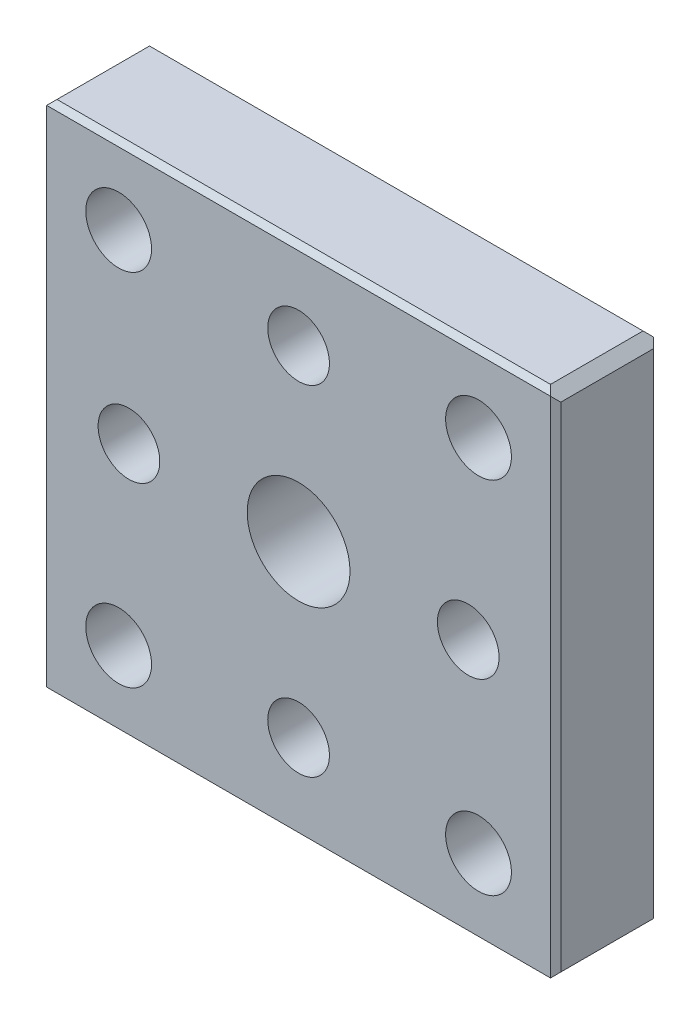
ISO-10303-21;
HEADER;
FILE_DESCRIPTION(('STEP AP214'),'2;1');
FILE_NAME('part.step','',(''),(''),'','','');
FILE_SCHEMA(('AUTOMOTIVE_DESIGN { 1 0 10303 214 1 1 1 1 }'));
ENDSEC;
DATA;
#1=APPLICATION_CONTEXT('core data for automotive mechanical design processes');
#2=APPLICATION_PROTOCOL_DEFINITION('international standard','automotive_design',2000,#1);
#3=PRODUCT_CONTEXT('',#1,'mechanical');
#4=PRODUCT('Part','Part','',(#3));
#5=PRODUCT_RELATED_PRODUCT_CATEGORY('part','',(#4));
#6=PRODUCT_DEFINITION_FORMATION('','',#4);
#7=PRODUCT_DEFINITION_CONTEXT('part definition',#1,'design');
#8=PRODUCT_DEFINITION('design','',#6,#7);
#9=PRODUCT_DEFINITION_SHAPE('','',#8);
#10=(LENGTH_UNIT() NAMED_UNIT(*) SI_UNIT(.MILLI.,.METRE.));
#11=(NAMED_UNIT(*) PLANE_ANGLE_UNIT() SI_UNIT($,.RADIAN.));
#12=(NAMED_UNIT(*) SI_UNIT($,.STERADIAN.) SOLID_ANGLE_UNIT());
#13=UNCERTAINTY_MEASURE_WITH_UNIT(LENGTH_MEASURE(1.E-05),#10,'distance_accuracy_value','');
#14=(GEOMETRIC_REPRESENTATION_CONTEXT(3) GLOBAL_UNCERTAINTY_ASSIGNED_CONTEXT((#13)) GLOBAL_UNIT_ASSIGNED_CONTEXT((#10,
#11,#12)) REPRESENTATION_CONTEXT('',''));
#15=CARTESIAN_POINT('',(0.,0.,0.));
#16=DIRECTION('',(0.,0.,1.));
#17=DIRECTION('',(1.,0.,0.));
#18=AXIS2_PLACEMENT_3D('',#15,#16,#17);
#19=CARTESIAN_POINT('',(0.,-16.5,-5.));
#20=DIRECTION('',(0.,0.,-1.));
#21=DIRECTION('',(-1.,0.,0.));
#22=AXIS2_PLACEMENT_3D('',#19,#20,#21);
#23=CYLINDRICAL_SURFACE('',#22,3.);
#24=CARTESIAN_POINT('',(0.,-16.5,5.));
#25=DIRECTION('',(0.,0.,-1.));
#26=DIRECTION('',(-1.,0.,0.));
#27=AXIS2_PLACEMENT_3D('',#24,#25,#26);
#28=CIRCLE('',#27,3.);
#29=CARTESIAN_POINT('',(-3.00000000000009,-16.5,5.));
#30=VERTEX_POINT('',#29);
#31=EDGE_CURVE('E312',#30,#30,#28,.T.);
#32=ORIENTED_EDGE('',*,*,#31,.F.);
#33=EDGE_LOOP('',(#32));
#34=FACE_BOUND('',#33,.T.);
#35=CARTESIAN_POINT('',(0.,-16.5,-2.));
#36=DIRECTION('',(0.,0.,-1.));
#37=DIRECTION('',(-1.,0.,0.));
#38=AXIS2_PLACEMENT_3D('',#35,#36,#37);
#39=CIRCLE('',#38,3.);
#40=CARTESIAN_POINT('',(-3.00000000000009,-16.5,-2.));
#41=VERTEX_POINT('',#40);
#42=EDGE_CURVE('E64',#41,#41,#39,.F.);
#43=ORIENTED_EDGE('',*,*,#42,.F.);
#44=EDGE_LOOP('',(#43));
#45=FACE_BOUND('',#44,.T.);
#46=ADVANCED_FACE('F59',(#34,#45),#23,.F.);
#47=CARTESIAN_POINT('',(-16.5000000000001,0.,-5.));
#48=DIRECTION('',(0.,0.,-1.));
#49=DIRECTION('',(-1.,0.,0.));
#50=AXIS2_PLACEMENT_3D('',#47,#48,#49);
#51=CYLINDRICAL_SURFACE('',#50,3.);
#52=CARTESIAN_POINT('',(-16.5000000000001,0.,5.));
#53=DIRECTION('',(0.,0.,-1.));
#54=DIRECTION('',(-1.,0.,0.));
#55=AXIS2_PLACEMENT_3D('',#52,#53,#54);
#56=CIRCLE('',#55,3.);
#57=CARTESIAN_POINT('',(-19.5000000000001,0.,5.));
#58=VERTEX_POINT('',#57);
#59=EDGE_CURVE('E303',#58,#58,#56,.T.);
#60=ORIENTED_EDGE('',*,*,#59,.F.);
#61=EDGE_LOOP('',(#60));
#62=FACE_BOUND('',#61,.T.);
#63=CARTESIAN_POINT('',(-16.5000000000001,0.,-2.));
#64=DIRECTION('',(0.,0.,-1.));
#65=DIRECTION('',(-1.,0.,0.));
#66=AXIS2_PLACEMENT_3D('',#63,#64,#65);
#67=CIRCLE('',#66,3.);
#68=CARTESIAN_POINT('',(-19.5000000000001,0.,-2.));
#69=VERTEX_POINT('',#68);
#70=EDGE_CURVE('E282',#69,#69,#67,.F.);
#71=ORIENTED_EDGE('',*,*,#70,.F.);
#72=EDGE_LOOP('',(#71));
#73=FACE_BOUND('',#72,.T.);
#74=ADVANCED_FACE('F422',(#62,#73),#51,.F.);
#75=CARTESIAN_POINT('',(0.,16.5,-5.));
#76=DIRECTION('',(0.,0.,-1.));
#77=DIRECTION('',(-1.,0.,0.));
#78=AXIS2_PLACEMENT_3D('',#75,#76,#77);
#79=CYLINDRICAL_SURFACE('',#78,3.);
#80=CARTESIAN_POINT('',(0.,16.5,5.));
#81=DIRECTION('',(0.,0.,-1.));
#82=DIRECTION('',(-1.,0.,0.));
#83=AXIS2_PLACEMENT_3D('',#80,#81,#82);
#84=CIRCLE('',#83,3.);
#85=CARTESIAN_POINT('',(-3.00000000000009,16.5,5.));
#86=VERTEX_POINT('',#85);
#87=EDGE_CURVE('E296',#86,#86,#84,.T.);
#88=ORIENTED_EDGE('',*,*,#87,.F.);
#89=EDGE_LOOP('',(#88));
#90=FACE_BOUND('',#89,.T.);
#91=CARTESIAN_POINT('',(0.,16.5,-2.));
#92=DIRECTION('',(0.,0.,-1.));
#93=DIRECTION('',(-1.,0.,0.));
#94=AXIS2_PLACEMENT_3D('',#91,#92,#93);
#95=CIRCLE('',#94,3.);
#96=CARTESIAN_POINT('',(-3.00000000000009,16.5,-2.));
#97=VERTEX_POINT('',#96);
#98=EDGE_CURVE('E278',#97,#97,#95,.F.);
#99=ORIENTED_EDGE('',*,*,#98,.F.);
#100=EDGE_LOOP('',(#99));
#101=FACE_BOUND('',#100,.T.);
#102=ADVANCED_FACE('F429',(#90,#101),#79,.F.);
#103=CARTESIAN_POINT('',(16.4999999999999,0.,-5.));
#104=DIRECTION('',(0.,0.,-1.));
#105=DIRECTION('',(-1.,0.,0.));
#106=AXIS2_PLACEMENT_3D('',#103,#104,#105);
#107=CYLINDRICAL_SURFACE('',#106,3.);
#108=CARTESIAN_POINT('',(16.4999999999999,0.,5.));
#109=DIRECTION('',(0.,0.,-1.));
#110=DIRECTION('',(-1.,0.,0.));
#111=AXIS2_PLACEMENT_3D('',#108,#109,#110);
#112=CIRCLE('',#111,3.);
#113=CARTESIAN_POINT('',(13.4999999999999,0.,5.));
#114=VERTEX_POINT('',#113);
#115=EDGE_CURVE('E290',#114,#114,#112,.T.);
#116=ORIENTED_EDGE('',*,*,#115,.F.);
#117=EDGE_LOOP('',(#116));
#118=FACE_BOUND('',#117,.T.);
#119=CARTESIAN_POINT('',(16.4999999999999,0.,-2.));
#120=DIRECTION('',(0.,0.,-1.));
#121=DIRECTION('',(-1.,0.,0.));
#122=AXIS2_PLACEMENT_3D('',#119,#120,#121);
#123=CIRCLE('',#122,3.);
#124=CARTESIAN_POINT('',(13.4999999999999,0.,-2.));
#125=VERTEX_POINT('',#124);
#126=EDGE_CURVE('E274',#125,#125,#123,.F.);
#127=ORIENTED_EDGE('',*,*,#126,.F.);
#128=EDGE_LOOP('',(#127));
#129=FACE_BOUND('',#128,.T.);
#130=ADVANCED_FACE('F474',(#118,#129),#107,.F.);
#131=CARTESIAN_POINT('',(25.,-25.,5.));
#132=DIRECTION('',(-1.,0.,0.));
#133=DIRECTION('',(0.,0.,1.));
#134=AXIS2_PLACEMENT_3D('',#131,#132,#133);
#135=PLANE('',#134);
#136=DIRECTION('',(0.,0.,-1.));
#137=VECTOR('',#136,1.);
#138=CARTESIAN_POINT('',(25.,-24.,5.));
#139=LINE('',#138,#137);
#140=CARTESIAN_POINT('',(25.,-24.,4.49999999999999));
#141=VERTEX_POINT('',#140);
#142=CARTESIAN_POINT('',(25.,-24.,-4.5));
#143=VERTEX_POINT('',#142);
#144=EDGE_CURVE('E172',#141,#143,#139,.T.);
#145=ORIENTED_EDGE('',*,*,#144,.T.);
#146=DIRECTION('',(0.,1.,0.));
#147=VECTOR('',#146,1.);
#148=CARTESIAN_POINT('',(25.,24.,-4.5));
#149=LINE('',#148,#147);
#150=CARTESIAN_POINT('',(25.,24.,-4.5));
#151=VERTEX_POINT('',#150);
#152=EDGE_CURVE('E269',#143,#151,#149,.T.);
#153=ORIENTED_EDGE('',*,*,#152,.T.);
#154=DIRECTION('',(0.,0.,1.));
#155=VECTOR('',#154,1.);
#156=CARTESIAN_POINT('',(25.,24.,5.));
#157=LINE('',#156,#155);
#158=CARTESIAN_POINT('',(25.,24.,4.49999999999999));
#159=VERTEX_POINT('',#158);
#160=EDGE_CURVE('E356',#151,#159,#157,.T.);
#161=ORIENTED_EDGE('',*,*,#160,.T.);
#162=DIRECTION('',(0.,-1.,0.));
#163=VECTOR('',#162,1.);
#164=CARTESIAN_POINT('',(25.,-25.,4.49999999999999));
#165=LINE('',#164,#163);
#166=EDGE_CURVE('E266',#159,#141,#165,.T.);
#167=ORIENTED_EDGE('',*,*,#166,.T.);
#168=EDGE_LOOP('',(#145,#153,#161,#167));
#169=FACE_BOUND('',#168,.T.);
#170=ADVANCED_FACE('F406',(#169),#135,.F.);
#171=CARTESIAN_POINT('',(-25.,25.,5.));
#172=DIRECTION('',(0.,-1.,0.));
#173=DIRECTION('',(0.,0.,-1.));
#174=AXIS2_PLACEMENT_3D('',#171,#172,#173);
#175=PLANE('',#174);
#176=DIRECTION('',(0.,0.,-1.));
#177=VECTOR('',#176,1.);
#178=CARTESIAN_POINT('',(24.,25.,5.));
#179=LINE('',#178,#177);
#180=CARTESIAN_POINT('',(24.,25.,4.5));
#181=VERTEX_POINT('',#180);
#182=CARTESIAN_POINT('',(24.,25.,-4.5));
#183=VERTEX_POINT('',#182);
#184=EDGE_CURVE('E376',#181,#183,#179,.T.);
#185=ORIENTED_EDGE('',*,*,#184,.T.);
#186=DIRECTION('',(-1.,0.,0.));
#187=VECTOR('',#186,1.);
#188=CARTESIAN_POINT('',(-24.,25.,-4.5));
#189=LINE('',#188,#187);
#190=CARTESIAN_POINT('',(-24.,25.,-4.5));
#191=VERTEX_POINT('',#190);
#192=EDGE_CURVE('E239',#183,#191,#189,.T.);
#193=ORIENTED_EDGE('',*,*,#192,.T.);
#194=DIRECTION('',(0.,0.,1.));
#195=VECTOR('',#194,1.);
#196=CARTESIAN_POINT('',(-24.,25.,5.));
#197=LINE('',#196,#195);
#198=CARTESIAN_POINT('',(-24.,25.,4.5));
#199=VERTEX_POINT('',#198);
#200=EDGE_CURVE('E380',#191,#199,#197,.T.);
#201=ORIENTED_EDGE('',*,*,#200,.T.);
#202=DIRECTION('',(1.,0.,0.));
#203=VECTOR('',#202,1.);
#204=CARTESIAN_POINT('',(-25.,25.,4.5));
#205=LINE('',#204,#203);
#206=EDGE_CURVE('E236',#199,#181,#205,.T.);
#207=ORIENTED_EDGE('',*,*,#206,.T.);
#208=EDGE_LOOP('',(#185,#193,#201,#207));
#209=FACE_BOUND('',#208,.T.);
#210=ADVANCED_FACE('F467',(#209),#175,.F.);
#211=CARTESIAN_POINT('',(-25.,-25.,5.));
#212=DIRECTION('',(1.,0.,0.));
#213=DIRECTION('',(0.,0.,-1.));
#214=AXIS2_PLACEMENT_3D('',#211,#212,#213);
#215=PLANE('',#214);
#216=DIRECTION('',(0.,0.,-1.));
#217=VECTOR('',#216,1.);
#218=CARTESIAN_POINT('',(-25.,24.,5.));
#219=LINE('',#218,#217);
#220=CARTESIAN_POINT('',(-25.,24.,4.49999999999999));
#221=VERTEX_POINT('',#220);
#222=CARTESIAN_POINT('',(-25.,24.,-4.5));
#223=VERTEX_POINT('',#222);
#224=EDGE_CURVE('E368',#221,#223,#219,.T.);
#225=ORIENTED_EDGE('',*,*,#224,.T.);
#226=DIRECTION('',(0.,-1.,0.));
#227=VECTOR('',#226,1.);
#228=CARTESIAN_POINT('',(-25.,-24.,-4.5));
#229=LINE('',#228,#227);
#230=CARTESIAN_POINT('',(-25.,-24.,-4.5));
#231=VERTEX_POINT('',#230);
#232=EDGE_CURVE('E13',#223,#231,#229,.T.);
#233=ORIENTED_EDGE('',*,*,#232,.T.);
#234=DIRECTION('',(0.,0.,1.));
#235=VECTOR('',#234,1.);
#236=CARTESIAN_POINT('',(-25.,-24.,5.));
#237=LINE('',#236,#235);
#238=CARTESIAN_POINT('',(-25.,-24.,4.49999999999999));
#239=VERTEX_POINT('',#238);
#240=EDGE_CURVE('E372',#231,#239,#237,.T.);
#241=ORIENTED_EDGE('',*,*,#240,.T.);
#242=DIRECTION('',(0.,1.,0.));
#243=VECTOR('',#242,1.);
#244=CARTESIAN_POINT('',(-25.,-25.,4.49999999999999));
#245=LINE('',#244,#243);
#246=EDGE_CURVE('E70',#239,#221,#245,.T.);
#247=ORIENTED_EDGE('',*,*,#246,.T.);
#248=EDGE_LOOP('',(#225,#233,#241,#247));
#249=FACE_BOUND('',#248,.T.);
#250=ADVANCED_FACE('F464',(#249),#215,.F.);
#251=CARTESIAN_POINT('',(-25.,-25.,5.));
#252=DIRECTION('',(0.,1.,0.));
#253=DIRECTION('',(0.,0.,1.));
#254=AXIS2_PLACEMENT_3D('',#251,#252,#253);
#255=PLANE('',#254);
#256=DIRECTION('',(0.,0.,1.));
#257=VECTOR('',#256,1.);
#258=CARTESIAN_POINT('',(24.,-25.,5.));
#259=LINE('',#258,#257);
#260=CARTESIAN_POINT('',(24.,-25.,-4.5));
#261=VERTEX_POINT('',#260);
#262=CARTESIAN_POINT('',(24.,-25.,4.5));
#263=VERTEX_POINT('',#262);
#264=EDGE_CURVE('E365',#261,#263,#259,.T.);
#265=ORIENTED_EDGE('',*,*,#264,.T.);
#266=DIRECTION('',(-1.,0.,0.));
#267=VECTOR('',#266,1.);
#268=CARTESIAN_POINT('',(-25.,-25.,4.5));
#269=LINE('',#268,#267);
#270=CARTESIAN_POINT('',(-24.,-25.,4.5));
#271=VERTEX_POINT('',#270);
#272=EDGE_CURVE('E160',#263,#271,#269,.T.);
#273=ORIENTED_EDGE('',*,*,#272,.T.);
#274=DIRECTION('',(0.,0.,-1.));
#275=VECTOR('',#274,1.);
#276=CARTESIAN_POINT('',(-24.,-25.,5.));
#277=LINE('',#276,#275);
#278=CARTESIAN_POINT('',(-24.,-25.,-4.5));
#279=VERTEX_POINT('',#278);
#280=EDGE_CURVE('E361',#271,#279,#277,.T.);
#281=ORIENTED_EDGE('',*,*,#280,.T.);
#282=DIRECTION('',(1.,0.,0.));
#283=VECTOR('',#282,1.);
#284=CARTESIAN_POINT('',(24.,-25.,-4.5));
#285=LINE('',#284,#283);
#286=EDGE_CURVE('E202',#279,#261,#285,.T.);
#287=ORIENTED_EDGE('',*,*,#286,.T.);
#288=EDGE_LOOP('',(#265,#273,#281,#287));
#289=FACE_BOUND('',#288,.T.);
#290=ADVANCED_FACE('F399',(#289),#255,.F.);
#291=CARTESIAN_POINT('',(0.,0.,5.));
#292=DIRECTION('',(0.,0.,-1.));
#293=DIRECTION('',(-1.,0.,0.));
#294=AXIS2_PLACEMENT_3D('',#291,#292,#293);
#295=PLANE('',#294);
#296=ORIENTED_EDGE('',*,*,#115,.T.);
#297=EDGE_LOOP('',(#296));
#298=FACE_BOUND('',#297,.T.);
#299=ORIENTED_EDGE('',*,*,#87,.T.);
#300=EDGE_LOOP('',(#299));
#301=FACE_BOUND('',#300,.T.);
#302=ORIENTED_EDGE('',*,*,#59,.T.);
#303=EDGE_LOOP('',(#302));
#304=FACE_BOUND('',#303,.T.);
#305=ORIENTED_EDGE('',*,*,#31,.T.);
#306=EDGE_LOOP('',(#305));
#307=FACE_BOUND('',#306,.T.);
#308=CARTESIAN_POINT('',(0.,0.,5.));
#309=DIRECTION('',(0.,0.,1.));
#310=DIRECTION('',(1.,0.,0.));
#311=AXIS2_PLACEMENT_3D('',#308,#309,#310);
#312=CIRCLE('',#311,5.);
#313=CARTESIAN_POINT('',(5.,0.,5.));
#314=VERTEX_POINT('',#313);
#315=EDGE_CURVE('E317',#314,#314,#312,.T.);
#316=ORIENTED_EDGE('',*,*,#315,.F.);
#317=EDGE_LOOP('',(#316));
#318=FACE_BOUND('',#317,.T.);
#319=CARTESIAN_POINT('',(-17.5,17.5,5.));
#320=DIRECTION('',(0.,0.,1.));
#321=DIRECTION('',(1.,0.,0.));
#322=AXIS2_PLACEMENT_3D('',#319,#320,#321);
#323=CIRCLE('',#322,3.19999999999999);
#324=CARTESIAN_POINT('',(-14.3,17.5,5.));
#325=VERTEX_POINT('',#324);
#326=EDGE_CURVE('E321',#325,#325,#323,.T.);
#327=ORIENTED_EDGE('',*,*,#326,.F.);
#328=EDGE_LOOP('',(#327));
#329=FACE_BOUND('',#328,.T.);
#330=CARTESIAN_POINT('',(17.5,17.5,5.));
#331=DIRECTION('',(0.,0.,1.));
#332=DIRECTION('',(1.,0.,0.));
#333=AXIS2_PLACEMENT_3D('',#330,#331,#332);
#334=CIRCLE('',#333,3.19999999999999);
#335=CARTESIAN_POINT('',(20.7,17.5,5.));
#336=VERTEX_POINT('',#335);
#337=EDGE_CURVE('E332',#336,#336,#334,.T.);
#338=ORIENTED_EDGE('',*,*,#337,.F.);
#339=EDGE_LOOP('',(#338));
#340=FACE_BOUND('',#339,.T.);
#341=CARTESIAN_POINT('',(17.5,-17.5,5.));
#342=DIRECTION('',(0.,0.,1.));
#343=DIRECTION('',(1.,0.,0.));
#344=AXIS2_PLACEMENT_3D('',#341,#342,#343);
#345=CIRCLE('',#344,3.19999999999999);
#346=CARTESIAN_POINT('',(20.7,-17.5,5.));
#347=VERTEX_POINT('',#346);
#348=EDGE_CURVE('E340',#347,#347,#345,.T.);
#349=ORIENTED_EDGE('',*,*,#348,.F.);
#350=EDGE_LOOP('',(#349));
#351=FACE_BOUND('',#350,.T.);
#352=CARTESIAN_POINT('',(-17.5,-17.5,5.));
#353=DIRECTION('',(0.,0.,1.));
#354=DIRECTION('',(1.,0.,0.));
#355=AXIS2_PLACEMENT_3D('',#352,#353,#354);
#356=CIRCLE('',#355,3.19999999999999);
#357=CARTESIAN_POINT('',(-14.3,-17.5,5.));
#358=VERTEX_POINT('',#357);
#359=EDGE_CURVE('E348',#358,#358,#356,.T.);
#360=ORIENTED_EDGE('',*,*,#359,.F.);
#361=EDGE_LOOP('',(#360));
#362=FACE_BOUND('',#361,.T.);
#363=DIRECTION('',(1.,0.,0.));
#364=VECTOR('',#363,1.);
#365=CARTESIAN_POINT('',(0.,-24.5,5.));
#366=LINE('',#365,#364);
#367=CARTESIAN_POINT('',(-24.5,-24.5,5.));
#368=VERTEX_POINT('',#367);
#369=CARTESIAN_POINT('',(24.5,-24.5,5.));
#370=VERTEX_POINT('',#369);
#371=EDGE_CURVE('E159',#368,#370,#366,.T.);
#372=ORIENTED_EDGE('',*,*,#371,.T.);
#373=DIRECTION('',(0.,1.,0.));
#374=VECTOR('',#373,1.);
#375=CARTESIAN_POINT('',(24.5,0.,5.));
#376=LINE('',#375,#374);
#377=CARTESIAN_POINT('',(24.5,24.5,5.));
#378=VERTEX_POINT('',#377);
#379=EDGE_CURVE('E177',#370,#378,#376,.T.);
#380=ORIENTED_EDGE('',*,*,#379,.T.);
#381=DIRECTION('',(-1.,0.,0.));
#382=VECTOR('',#381,1.);
#383=CARTESIAN_POINT('',(0.,24.5,5.));
#384=LINE('',#383,#382);
#385=CARTESIAN_POINT('',(-24.5,24.5,5.));
#386=VERTEX_POINT('',#385);
#387=EDGE_CURVE('E188',#378,#386,#384,.T.);
#388=ORIENTED_EDGE('',*,*,#387,.T.);
#389=DIRECTION('',(0.,-1.,0.));
#390=VECTOR('',#389,1.);
#391=CARTESIAN_POINT('',(-24.5,0.,5.));
#392=LINE('',#391,#390);
#393=EDGE_CURVE('E186',#386,#368,#392,.T.);
#394=ORIENTED_EDGE('',*,*,#393,.T.);
#395=EDGE_LOOP('',(#372,#380,#388,#394));
#396=FACE_BOUND('',#395,.T.);
#397=ADVANCED_FACE('F182',(#298,#301,#304,#307,#318,#329,#340,#351,#362,#396),#295,.F.);
#398=CARTESIAN_POINT('',(0.,0.,-5.));
#399=DIRECTION('',(0.,0.,-1.));
#400=DIRECTION('',(-1.,0.,0.));
#401=AXIS2_PLACEMENT_3D('',#398,#399,#400);
#402=PLANE('',#401);
#403=CARTESIAN_POINT('',(-16.5000000000001,0.,-5.));
#404=DIRECTION('',(0.,0.,-1.));
#405=DIRECTION('',(-1.,0.,0.));
#406=AXIS2_PLACEMENT_3D('',#403,#404,#405);
#407=CIRCLE('',#406,6.25000000000001);
#408=CARTESIAN_POINT('',(-22.7500000000001,0.,-5.));
#409=VERTEX_POINT('',#408);
#410=EDGE_CURVE('E724',#409,#409,#407,.T.);
#411=ORIENTED_EDGE('',*,*,#410,.F.);
#412=EDGE_LOOP('',(#411));
#413=FACE_BOUND('',#412,.T.);
#414=CARTESIAN_POINT('',(0.,-16.5,-5.));
#415=DIRECTION('',(0.,0.,-1.));
#416=DIRECTION('',(-1.,0.,0.));
#417=AXIS2_PLACEMENT_3D('',#414,#415,#416);
#418=CIRCLE('',#417,6.25);
#419=CARTESIAN_POINT('',(-6.25000000000009,-16.5,-5.));
#420=VERTEX_POINT('',#419);
#421=EDGE_CURVE('E720',#420,#420,#418,.T.);
#422=ORIENTED_EDGE('',*,*,#421,.F.);
#423=EDGE_LOOP('',(#422));
#424=FACE_BOUND('',#423,.T.);
#425=CARTESIAN_POINT('',(16.4999999999999,1.73472347597681E-13,-5.));
#426=DIRECTION('',(0.,0.,-1.));
#427=DIRECTION('',(-1.,0.,0.));
#428=AXIS2_PLACEMENT_3D('',#425,#426,#427);
#429=CIRCLE('',#428,6.25000000000001);
#430=CARTESIAN_POINT('',(10.2499999999999,1.73472347597681E-13,-5.));
#431=VERTEX_POINT('',#430);
#432=EDGE_CURVE('E710',#431,#431,#429,.T.);
#433=ORIENTED_EDGE('',*,*,#432,.F.);
#434=EDGE_LOOP('',(#433));
#435=FACE_BOUND('',#434,.T.);
#436=CARTESIAN_POINT('',(0.,16.5,-5.));
#437=DIRECTION('',(0.,0.,-1.));
#438=DIRECTION('',(-1.,0.,0.));
#439=AXIS2_PLACEMENT_3D('',#436,#437,#438);
#440=CIRCLE('',#439,6.25);
#441=CARTESIAN_POINT('',(-6.25000000000009,16.5,-5.));
#442=VERTEX_POINT('',#441);
#443=EDGE_CURVE('E701',#442,#442,#440,.T.);
#444=ORIENTED_EDGE('',*,*,#443,.F.);
#445=EDGE_LOOP('',(#444));
#446=FACE_BOUND('',#445,.T.);
#447=CARTESIAN_POINT('',(0.,0.,-5.));
#448=DIRECTION('',(0.,0.,-1.));
#449=DIRECTION('',(-1.,0.,0.));
#450=AXIS2_PLACEMENT_3D('',#447,#448,#449);
#451=CIRCLE('',#450,5.);
#452=CARTESIAN_POINT('',(-5.,0.,-5.));
#453=VERTEX_POINT('',#452);
#454=EDGE_CURVE('E316',#453,#453,#451,.F.);
#455=ORIENTED_EDGE('',*,*,#454,.T.);
#456=EDGE_LOOP('',(#455));
#457=FACE_BOUND('',#456,.T.);
#458=CARTESIAN_POINT('',(-17.5,17.5,-5.));
#459=DIRECTION('',(0.,0.,1.));
#460=DIRECTION('',(1.,0.,0.));
#461=AXIS2_PLACEMENT_3D('',#458,#459,#460);
#462=CIRCLE('',#461,3.2);
#463=CARTESIAN_POINT('',(-14.3,17.5,-5.));
#464=VERTEX_POINT('',#463);
#465=EDGE_CURVE('E328',#464,#464,#462,.T.);
#466=ORIENTED_EDGE('',*,*,#465,.T.);
#467=EDGE_LOOP('',(#466));
#468=FACE_BOUND('',#467,.T.);
#469=CARTESIAN_POINT('',(17.5,17.5,-5.));
#470=DIRECTION('',(0.,0.,1.));
#471=DIRECTION('',(1.,0.,0.));
#472=AXIS2_PLACEMENT_3D('',#469,#470,#471);
#473=CIRCLE('',#472,3.2);
#474=CARTESIAN_POINT('',(20.7,17.5,-5.));
#475=VERTEX_POINT('',#474);
#476=EDGE_CURVE('E336',#475,#475,#473,.T.);
#477=ORIENTED_EDGE('',*,*,#476,.T.);
#478=EDGE_LOOP('',(#477));
#479=FACE_BOUND('',#478,.T.);
#480=CARTESIAN_POINT('',(17.5,-17.5,-5.));
#481=DIRECTION('',(0.,0.,1.));
#482=DIRECTION('',(1.,0.,0.));
#483=AXIS2_PLACEMENT_3D('',#480,#481,#482);
#484=CIRCLE('',#483,3.2);
#485=CARTESIAN_POINT('',(20.7,-17.5,-5.));
#486=VERTEX_POINT('',#485);
#487=EDGE_CURVE('E344',#486,#486,#484,.T.);
#488=ORIENTED_EDGE('',*,*,#487,.T.);
#489=EDGE_LOOP('',(#488));
#490=FACE_BOUND('',#489,.T.);
#491=CARTESIAN_POINT('',(-17.5,-17.5,-5.));
#492=DIRECTION('',(0.,0.,1.));
#493=DIRECTION('',(1.,0.,0.));
#494=AXIS2_PLACEMENT_3D('',#491,#492,#493);
#495=CIRCLE('',#494,3.2);
#496=CARTESIAN_POINT('',(-14.3,-17.5,-5.));
#497=VERTEX_POINT('',#496);
#498=EDGE_CURVE('E352',#497,#497,#495,.T.);
#499=ORIENTED_EDGE('',*,*,#498,.T.);
#500=EDGE_LOOP('',(#499));
#501=FACE_BOUND('',#500,.T.);
#502=DIRECTION('',(1.,0.,0.));
#503=VECTOR('',#502,1.);
#504=CARTESIAN_POINT('',(24.,24.5,-5.));
#505=LINE('',#504,#503);
#506=CARTESIAN_POINT('',(-24.5,24.5,-5.));
#507=VERTEX_POINT('',#506);
#508=CARTESIAN_POINT('',(24.5,24.5,-5.));
#509=VERTEX_POINT('',#508);
#510=EDGE_CURVE('E226',#507,#509,#505,.T.);
#511=ORIENTED_EDGE('',*,*,#510,.T.);
#512=DIRECTION('',(0.,-1.,0.));
#513=VECTOR('',#512,1.);
#514=CARTESIAN_POINT('',(24.5,-24.,-5.));
#515=LINE('',#514,#513);
#516=CARTESIAN_POINT('',(24.5,-24.5,-5.));
#517=VERTEX_POINT('',#516);
#518=EDGE_CURVE('E233',#509,#517,#515,.T.);
#519=ORIENTED_EDGE('',*,*,#518,.T.);
#520=DIRECTION('',(-1.,0.,0.));
#521=VECTOR('',#520,1.);
#522=CARTESIAN_POINT('',(-24.,-24.5,-5.));
#523=LINE('',#522,#521);
#524=CARTESIAN_POINT('',(-24.5,-24.5,-5.));
#525=VERTEX_POINT('',#524);
#526=EDGE_CURVE('E230',#517,#525,#523,.T.);
#527=ORIENTED_EDGE('',*,*,#526,.T.);
#528=DIRECTION('',(0.,1.,0.));
#529=VECTOR('',#528,1.);
#530=CARTESIAN_POINT('',(-24.5,24.,-5.));
#531=LINE('',#530,#529);
#532=EDGE_CURVE('E222',#525,#507,#531,.T.);
#533=ORIENTED_EDGE('',*,*,#532,.T.);
#534=EDGE_LOOP('',(#511,#519,#527,#533));
#535=FACE_BOUND('',#534,.T.);
#536=ADVANCED_FACE('F455',(#413,#424,#435,#446,#457,#468,#479,#490,#501,#535),#402,.T.);
#537=CARTESIAN_POINT('',(-17.5,-17.5,5.));
#538=DIRECTION('',(0.,0.,1.));
#539=DIRECTION('',(1.,0.,0.));
#540=AXIS2_PLACEMENT_3D('',#537,#538,#539);
#541=CYLINDRICAL_SURFACE('',#540,3.19999999999999);
#542=ORIENTED_EDGE('',*,*,#498,.F.);
#543=EDGE_LOOP('',(#542));
#544=FACE_BOUND('',#543,.T.);
#545=ORIENTED_EDGE('',*,*,#359,.T.);
#546=EDGE_LOOP('',(#545));
#547=FACE_BOUND('',#546,.T.);
#548=ADVANCED_FACE('F451',(#544,#547),#541,.F.);
#549=CARTESIAN_POINT('',(17.5,-17.5,5.));
#550=DIRECTION('',(0.,0.,1.));
#551=DIRECTION('',(1.,0.,0.));
#552=AXIS2_PLACEMENT_3D('',#549,#550,#551);
#553=CYLINDRICAL_SURFACE('',#552,3.19999999999999);
#554=ORIENTED_EDGE('',*,*,#487,.F.);
#555=EDGE_LOOP('',(#554));
#556=FACE_BOUND('',#555,.T.);
#557=ORIENTED_EDGE('',*,*,#348,.T.);
#558=EDGE_LOOP('',(#557));
#559=FACE_BOUND('',#558,.T.);
#560=ADVANCED_FACE('F447',(#556,#559),#553,.F.);
#561=CARTESIAN_POINT('',(17.5,17.5,5.));
#562=DIRECTION('',(0.,0.,1.));
#563=DIRECTION('',(1.,0.,0.));
#564=AXIS2_PLACEMENT_3D('',#561,#562,#563);
#565=CYLINDRICAL_SURFACE('',#564,3.19999999999999);
#566=ORIENTED_EDGE('',*,*,#476,.F.);
#567=EDGE_LOOP('',(#566));
#568=FACE_BOUND('',#567,.T.);
#569=ORIENTED_EDGE('',*,*,#337,.T.);
#570=EDGE_LOOP('',(#569));
#571=FACE_BOUND('',#570,.T.);
#572=ADVANCED_FACE('F443',(#568,#571),#565,.F.);
#573=CARTESIAN_POINT('',(-17.5,17.5,5.));
#574=DIRECTION('',(0.,0.,1.));
#575=DIRECTION('',(1.,0.,0.));
#576=AXIS2_PLACEMENT_3D('',#573,#574,#575);
#577=CYLINDRICAL_SURFACE('',#576,3.19999999999999);
#578=ORIENTED_EDGE('',*,*,#465,.F.);
#579=EDGE_LOOP('',(#578));
#580=FACE_BOUND('',#579,.T.);
#581=ORIENTED_EDGE('',*,*,#326,.T.);
#582=EDGE_LOOP('',(#581));
#583=FACE_BOUND('',#582,.T.);
#584=ADVANCED_FACE('F439',(#580,#583),#577,.F.);
#585=CARTESIAN_POINT('',(0.,0.,-5.001));
#586=DIRECTION('',(0.,0.,1.));
#587=DIRECTION('',(1.,0.,0.));
#588=AXIS2_PLACEMENT_3D('',#585,#586,#587);
#589=CYLINDRICAL_SURFACE('',#588,5.);
#590=ORIENTED_EDGE('',*,*,#454,.F.);
#591=EDGE_LOOP('',(#590));
#592=FACE_BOUND('',#591,.T.);
#593=ORIENTED_EDGE('',*,*,#315,.T.);
#594=EDGE_LOOP('',(#593));
#595=FACE_BOUND('',#594,.T.);
#596=ADVANCED_FACE('F436',(#592,#595),#589,.F.);
#597=CARTESIAN_POINT('',(25.,-24.,5.));
#598=DIRECTION('',(-0.707106781186547,0.707106781186547,0.));
#599=DIRECTION('',(0.,0.,-1.));
#600=AXIS2_PLACEMENT_3D('',#597,#598,#599);
#601=PLANE('',#600);
#602=ORIENTED_EDGE('',*,*,#264,.F.);
#603=DIRECTION('',(-0.577350269189626,-0.577350269189626,0.577350269189626));
#604=VECTOR('',#603,1.);
#605=CARTESIAN_POINT('',(21.5,-27.5,-1.99999999999999));
#606=LINE('',#605,#604);
#607=EDGE_CURVE('E198',#261,#517,#606,.F.);
#608=ORIENTED_EDGE('',*,*,#607,.T.);
#609=DIRECTION('',(-0.577350269189626,-0.577350269189626,-0.577350269189626));
#610=VECTOR('',#609,1.);
#611=CARTESIAN_POINT('',(28.1666666666667,-20.8333333333333,-1.33333333333334));
#612=LINE('',#611,#610);
#613=EDGE_CURVE('E165',#517,#143,#612,.F.);
#614=ORIENTED_EDGE('',*,*,#613,.T.);
#615=ORIENTED_EDGE('',*,*,#144,.F.);
#616=DIRECTION('',(-0.577350269189626,-0.577350269189626,0.577350269189626));
#617=VECTOR('',#616,1.);
#618=CARTESIAN_POINT('',(24.8333333333333,-24.1666666666667,4.66666666666666));
#619=LINE('',#618,#617);
#620=EDGE_CURVE('E166',#141,#370,#619,.T.);
#621=ORIENTED_EDGE('',*,*,#620,.T.);
#622=DIRECTION('',(-0.577350269189623,-0.577350269189623,-0.577350269189631));
#623=VECTOR('',#622,1.);
#624=CARTESIAN_POINT('',(24.8333333333333,-24.1666666666667,5.33333333333333));
#625=LINE('',#624,#623);
#626=EDGE_CURVE('E154',#370,#263,#625,.T.);
#627=ORIENTED_EDGE('',*,*,#626,.T.);
#628=EDGE_LOOP('',(#602,#608,#614,#615,#621,#627));
#629=FACE_BOUND('',#628,.T.);
#630=ADVANCED_FACE('F170',(#629),#601,.F.);
#631=CARTESIAN_POINT('',(-24.,-25.,5.));
#632=DIRECTION('',(0.70710678118655,0.707106781186545,0.));
#633=DIRECTION('',(0.,0.,-1.));
#634=AXIS2_PLACEMENT_3D('',#631,#632,#633);
#635=PLANE('',#634);
#636=DIRECTION('',(-0.577350269189625,0.577350269189628,0.577350269189625));
#637=VECTOR('',#636,1.);
#638=CARTESIAN_POINT('',(-27.5,-21.5,-2.00000000000001));
#639=LINE('',#638,#637);
#640=EDGE_CURVE('E215',#231,#525,#639,.F.);
#641=ORIENTED_EDGE('',*,*,#640,.T.);
#642=DIRECTION('',(-0.577350269189623,0.577350269189627,-0.577350269189627));
#643=VECTOR('',#642,1.);
#644=CARTESIAN_POINT('',(-20.8333333333333,-28.1666666666667,-1.33333333333332));
#645=LINE('',#644,#643);
#646=EDGE_CURVE('E219',#525,#279,#645,.F.);
#647=ORIENTED_EDGE('',*,*,#646,.T.);
#648=ORIENTED_EDGE('',*,*,#280,.F.);
#649=DIRECTION('',(-0.577350269189621,0.577350269189625,0.577350269189633));
#650=VECTOR('',#649,1.);
#651=CARTESIAN_POINT('',(-24.1666666666667,-24.8333333333333,4.66666666666667));
#652=LINE('',#651,#650);
#653=EDGE_CURVE('E211',#271,#368,#652,.T.);
#654=ORIENTED_EDGE('',*,*,#653,.T.);
#655=DIRECTION('',(-0.577350269189625,0.577350269189628,-0.577350269189625));
#656=VECTOR('',#655,1.);
#657=CARTESIAN_POINT('',(-24.1666666666667,-24.8333333333333,5.33333333333333));
#658=LINE('',#657,#656);
#659=EDGE_CURVE('E208',#368,#239,#658,.T.);
#660=ORIENTED_EDGE('',*,*,#659,.T.);
#661=ORIENTED_EDGE('',*,*,#240,.F.);
#662=EDGE_LOOP('',(#641,#647,#648,#654,#660,#661));
#663=FACE_BOUND('',#662,.T.);
#664=ADVANCED_FACE('F395',(#663),#635,.F.);
#665=CARTESIAN_POINT('',(-25.,24.,5.));
#666=DIRECTION('',(0.707106781186545,-0.70710678118655,0.));
#667=DIRECTION('',(0.,0.,-1.));
#668=AXIS2_PLACEMENT_3D('',#665,#666,#667);
#669=PLANE('',#668);
#670=ORIENTED_EDGE('',*,*,#200,.F.);
#671=DIRECTION('',(0.577350269189628,0.577350269189625,0.577350269189625));
#672=VECTOR('',#671,1.);
#673=CARTESIAN_POINT('',(-21.5,27.5,-2.00000000000002));
#674=LINE('',#673,#672);
#675=EDGE_CURVE('E253',#191,#507,#674,.F.);
#676=ORIENTED_EDGE('',*,*,#675,.T.);
#677=DIRECTION('',(0.577350269189627,0.577350269189623,-0.577350269189627));
#678=VECTOR('',#677,1.);
#679=CARTESIAN_POINT('',(-28.1666666666667,20.8333333333333,-1.33333333333332));
#680=LINE('',#679,#678);
#681=EDGE_CURVE('E250',#507,#223,#680,.F.);
#682=ORIENTED_EDGE('',*,*,#681,.T.);
#683=ORIENTED_EDGE('',*,*,#224,.F.);
#684=DIRECTION('',(0.577350269189627,0.577350269189623,0.577350269189627));
#685=VECTOR('',#684,1.);
#686=CARTESIAN_POINT('',(-24.8333333333333,24.1666666666667,4.66666666666666));
#687=LINE('',#686,#685);
#688=EDGE_CURVE('E243',#221,#386,#687,.T.);
#689=ORIENTED_EDGE('',*,*,#688,.T.);
#690=DIRECTION('',(0.577350269189626,0.577350269189622,-0.57735026918963));
#691=VECTOR('',#690,1.);
#692=CARTESIAN_POINT('',(-24.8333333333333,24.1666666666667,5.33333333333334));
#693=LINE('',#692,#691);
#694=EDGE_CURVE('E247',#386,#199,#693,.T.);
#695=ORIENTED_EDGE('',*,*,#694,.T.);
#696=EDGE_LOOP('',(#670,#676,#682,#683,#689,#695));
#697=FACE_BOUND('',#696,.T.);
#698=ADVANCED_FACE('F486',(#697),#669,.F.);
#699=CARTESIAN_POINT('',(24.,25.,5.));
#700=DIRECTION('',(-0.70710678118655,-0.707106781186545,0.));
#701=DIRECTION('',(0.,0.,-1.));
#702=AXIS2_PLACEMENT_3D('',#699,#700,#701);
#703=PLANE('',#702);
#704=DIRECTION('',(0.577350269189625,-0.577350269189628,0.577350269189625));
#705=VECTOR('',#704,1.);
#706=CARTESIAN_POINT('',(27.5,21.5,-2.00000000000001));
#707=LINE('',#706,#705);
#708=EDGE_CURVE('E86',#151,#509,#707,.F.);
#709=ORIENTED_EDGE('',*,*,#708,.T.);
#710=DIRECTION('',(0.577350269189623,-0.577350269189627,-0.577350269189627));
#711=VECTOR('',#710,1.);
#712=CARTESIAN_POINT('',(20.8333333333333,28.1666666666667,-1.33333333333332));
#713=LINE('',#712,#711);
#714=EDGE_CURVE('E263',#509,#183,#713,.F.);
#715=ORIENTED_EDGE('',*,*,#714,.T.);
#716=ORIENTED_EDGE('',*,*,#184,.F.);
#717=DIRECTION('',(0.577350269189621,-0.577350269189625,0.577350269189633));
#718=VECTOR('',#717,1.);
#719=CARTESIAN_POINT('',(24.1666666666667,24.8333333333333,4.66666666666667));
#720=LINE('',#719,#718);
#721=EDGE_CURVE('E258',#181,#378,#720,.T.);
#722=ORIENTED_EDGE('',*,*,#721,.T.);
#723=DIRECTION('',(0.577350269189625,-0.577350269189628,-0.577350269189625));
#724=VECTOR('',#723,1.);
#725=CARTESIAN_POINT('',(24.1666666666667,24.8333333333333,5.33333333333333));
#726=LINE('',#725,#724);
#727=EDGE_CURVE('E78',#378,#159,#726,.T.);
#728=ORIENTED_EDGE('',*,*,#727,.T.);
#729=ORIENTED_EDGE('',*,*,#160,.F.);
#730=EDGE_LOOP('',(#709,#715,#716,#722,#728,#729));
#731=FACE_BOUND('',#730,.T.);
#732=ADVANCED_FACE('F492',(#731),#703,.F.);
#733=CARTESIAN_POINT('',(0.,-24.5,5.));
#734=DIRECTION('',(0.,0.707106781186552,-0.707106781186543));
#735=DIRECTION('',(1.,0.,0.));
#736=AXIS2_PLACEMENT_3D('',#733,#734,#735);
#737=PLANE('',#736);
#738=ORIENTED_EDGE('',*,*,#653,.F.);
#739=ORIENTED_EDGE('',*,*,#272,.F.);
#740=ORIENTED_EDGE('',*,*,#626,.F.);
#741=ORIENTED_EDGE('',*,*,#371,.F.);
#742=EDGE_LOOP('',(#738,#739,#740,#741));
#743=FACE_BOUND('',#742,.T.);
#744=ADVANCED_FACE('F157',(#743),#737,.F.);
#745=CARTESIAN_POINT('',(-25.,-25.,-4.5));
#746=DIRECTION('',(0.,-0.707106781186547,-0.707106781186547));
#747=DIRECTION('',(-1.,0.,0.));
#748=AXIS2_PLACEMENT_3D('',#745,#746,#747);
#749=PLANE('',#748);
#750=ORIENTED_EDGE('',*,*,#646,.F.);
#751=ORIENTED_EDGE('',*,*,#526,.F.);
#752=ORIENTED_EDGE('',*,*,#607,.F.);
#753=ORIENTED_EDGE('',*,*,#286,.F.);
#754=EDGE_LOOP('',(#750,#751,#752,#753));
#755=FACE_BOUND('',#754,.T.);
#756=ADVANCED_FACE('F401',(#755),#749,.T.);
#757=CARTESIAN_POINT('',(-25.,25.,-4.5));
#758=DIRECTION('',(0.,0.707106781186547,-0.707106781186547));
#759=DIRECTION('',(1.,0.,0.));
#760=AXIS2_PLACEMENT_3D('',#757,#758,#759);
#761=PLANE('',#760);
#762=ORIENTED_EDGE('',*,*,#714,.F.);
#763=ORIENTED_EDGE('',*,*,#510,.F.);
#764=ORIENTED_EDGE('',*,*,#675,.F.);
#765=ORIENTED_EDGE('',*,*,#192,.F.);
#766=EDGE_LOOP('',(#762,#763,#764,#765));
#767=FACE_BOUND('',#766,.T.);
#768=ADVANCED_FACE('F418',(#767),#761,.T.);
#769=CARTESIAN_POINT('',(0.,24.5,5.));
#770=DIRECTION('',(0.,-0.707106781186552,-0.707106781186543));
#771=DIRECTION('',(-1.,0.,0.));
#772=AXIS2_PLACEMENT_3D('',#769,#770,#771);
#773=PLANE('',#772);
#774=ORIENTED_EDGE('',*,*,#721,.F.);
#775=ORIENTED_EDGE('',*,*,#206,.F.);
#776=ORIENTED_EDGE('',*,*,#694,.F.);
#777=ORIENTED_EDGE('',*,*,#387,.F.);
#778=EDGE_LOOP('',(#774,#775,#776,#777));
#779=FACE_BOUND('',#778,.T.);
#780=ADVANCED_FACE('F409',(#779),#773,.F.);
#781=CARTESIAN_POINT('',(25.,-25.,-4.5));
#782=DIRECTION('',(0.707106781186547,0.,-0.707106781186547));
#783=DIRECTION('',(0.,-1.,0.));
#784=AXIS2_PLACEMENT_3D('',#781,#782,#783);
#785=PLANE('',#784);
#786=ORIENTED_EDGE('',*,*,#613,.F.);
#787=ORIENTED_EDGE('',*,*,#518,.F.);
#788=ORIENTED_EDGE('',*,*,#708,.F.);
#789=ORIENTED_EDGE('',*,*,#152,.F.);
#790=EDGE_LOOP('',(#786,#787,#788,#789));
#791=FACE_BOUND('',#790,.T.);
#792=ADVANCED_FACE('F407',(#791),#785,.T.);
#793=CARTESIAN_POINT('',(24.5,0.,5.));
#794=DIRECTION('',(-0.707106781186547,0.,-0.707106781186547));
#795=DIRECTION('',(0.,1.,0.));
#796=AXIS2_PLACEMENT_3D('',#793,#794,#795);
#797=PLANE('',#796);
#798=ORIENTED_EDGE('',*,*,#620,.F.);
#799=ORIENTED_EDGE('',*,*,#166,.F.);
#800=ORIENTED_EDGE('',*,*,#727,.F.);
#801=ORIENTED_EDGE('',*,*,#379,.F.);
#802=EDGE_LOOP('',(#798,#799,#800,#801));
#803=FACE_BOUND('',#802,.T.);
#804=ADVANCED_FACE('F190',(#803),#797,.F.);
#805=CARTESIAN_POINT('',(-25.,-25.,-4.5));
#806=DIRECTION('',(-0.707106781186547,0.,-0.707106781186547));
#807=DIRECTION('',(0.,1.,0.));
#808=AXIS2_PLACEMENT_3D('',#805,#806,#807);
#809=PLANE('',#808);
#810=ORIENTED_EDGE('',*,*,#681,.F.);
#811=ORIENTED_EDGE('',*,*,#532,.F.);
#812=ORIENTED_EDGE('',*,*,#640,.F.);
#813=ORIENTED_EDGE('',*,*,#232,.F.);
#814=EDGE_LOOP('',(#810,#811,#812,#813));
#815=FACE_BOUND('',#814,.T.);
#816=ADVANCED_FACE('F416',(#815),#809,.T.);
#817=CARTESIAN_POINT('',(-24.5,0.,5.));
#818=DIRECTION('',(0.707106781186547,0.,-0.707106781186547));
#819=DIRECTION('',(0.,-1.,0.));
#820=AXIS2_PLACEMENT_3D('',#817,#818,#819);
#821=PLANE('',#820);
#822=ORIENTED_EDGE('',*,*,#688,.F.);
#823=ORIENTED_EDGE('',*,*,#246,.F.);
#824=ORIENTED_EDGE('',*,*,#659,.F.);
#825=ORIENTED_EDGE('',*,*,#393,.F.);
#826=EDGE_LOOP('',(#822,#823,#824,#825));
#827=FACE_BOUND('',#826,.T.);
#828=ADVANCED_FACE('F62',(#827),#821,.F.);
#829=CARTESIAN_POINT('',(16.4999999999999,1.73472347597681E-13,-2.));
#830=DIRECTION('',(0.,0.,-1.));
#831=DIRECTION('',(-1.,0.,0.));
#832=AXIS2_PLACEMENT_3D('',#829,#830,#831);
#833=PLANE('',#832);
#834=CARTESIAN_POINT('',(16.4999999999999,1.73472347597681E-13,-2.));
#835=DIRECTION('',(0.,0.,-1.));
#836=DIRECTION('',(-1.,0.,0.));
#837=AXIS2_PLACEMENT_3D('',#834,#835,#836);
#838=CIRCLE('',#837,6.25000000000001);
#839=CARTESIAN_POINT('',(10.2499999999999,1.73472347597681E-13,-2.));
#840=VERTEX_POINT('',#839);
#841=EDGE_CURVE('E705',#840,#840,#838,.T.);
#842=ORIENTED_EDGE('',*,*,#841,.T.);
#843=EDGE_LOOP('',(#842));
#844=FACE_BOUND('',#843,.T.);
#845=ORIENTED_EDGE('',*,*,#126,.T.);
#846=EDGE_LOOP('',(#845));
#847=FACE_BOUND('',#846,.T.);
#848=ADVANCED_FACE('F532',(#844,#847),#833,.T.);
#849=CARTESIAN_POINT('',(16.4999999999999,1.73472347597681E-13,-2.));
#850=DIRECTION('',(0.,0.,-1.));
#851=DIRECTION('',(-1.,0.,0.));
#852=AXIS2_PLACEMENT_3D('',#849,#850,#851);
#853=CYLINDRICAL_SURFACE('',#852,6.25000000000001);
#854=ORIENTED_EDGE('',*,*,#841,.F.);
#855=EDGE_LOOP('',(#854));
#856=FACE_BOUND('',#855,.T.);
#857=ORIENTED_EDGE('',*,*,#432,.T.);
#858=EDGE_LOOP('',(#857));
#859=FACE_BOUND('',#858,.T.);
#860=ADVANCED_FACE('F548',(#856,#859),#853,.F.);
#861=CARTESIAN_POINT('',(0.,16.5,-2.));
#862=DIRECTION('',(0.,0.,-1.));
#863=DIRECTION('',(-1.,0.,0.));
#864=AXIS2_PLACEMENT_3D('',#861,#862,#863);
#865=PLANE('',#864);
#866=CARTESIAN_POINT('',(0.,16.5,-2.));
#867=DIRECTION('',(0.,0.,-1.));
#868=DIRECTION('',(-1.,0.,0.));
#869=AXIS2_PLACEMENT_3D('',#866,#867,#868);
#870=CIRCLE('',#869,6.25);
#871=CARTESIAN_POINT('',(-6.25000000000009,16.5,-2.));
#872=VERTEX_POINT('',#871);
#873=EDGE_CURVE('E306',#872,#872,#870,.T.);
#874=ORIENTED_EDGE('',*,*,#873,.T.);
#875=EDGE_LOOP('',(#874));
#876=FACE_BOUND('',#875,.T.);
#877=ORIENTED_EDGE('',*,*,#98,.T.);
#878=EDGE_LOOP('',(#877));
#879=FACE_BOUND('',#878,.T.);
#880=ADVANCED_FACE('F554',(#876,#879),#865,.T.);
#881=CARTESIAN_POINT('',(0.,16.5,-2.));
#882=DIRECTION('',(0.,0.,-1.));
#883=DIRECTION('',(-1.,0.,0.));
#884=AXIS2_PLACEMENT_3D('',#881,#882,#883);
#885=CYLINDRICAL_SURFACE('',#884,6.25);
#886=ORIENTED_EDGE('',*,*,#873,.F.);
#887=EDGE_LOOP('',(#886));
#888=FACE_BOUND('',#887,.T.);
#889=ORIENTED_EDGE('',*,*,#443,.T.);
#890=EDGE_LOOP('',(#889));
#891=FACE_BOUND('',#890,.T.);
#892=ADVANCED_FACE('F561',(#888,#891),#885,.F.);
#893=CARTESIAN_POINT('',(-16.5000000000001,0.,-2.));
#894=DIRECTION('',(0.,0.,-1.));
#895=DIRECTION('',(-1.,0.,0.));
#896=AXIS2_PLACEMENT_3D('',#893,#894,#895);
#897=PLANE('',#896);
#898=CARTESIAN_POINT('',(-16.5000000000001,0.,-2.));
#899=DIRECTION('',(0.,0.,-1.));
#900=DIRECTION('',(-1.,0.,0.));
#901=AXIS2_PLACEMENT_3D('',#898,#899,#900);
#902=CIRCLE('',#901,6.25000000000001);
#903=CARTESIAN_POINT('',(-22.7500000000001,0.,-2.));
#904=VERTEX_POINT('',#903);
#905=EDGE_CURVE('E279',#904,#904,#902,.T.);
#906=ORIENTED_EDGE('',*,*,#905,.T.);
#907=EDGE_LOOP('',(#906));
#908=FACE_BOUND('',#907,.T.);
#909=ORIENTED_EDGE('',*,*,#70,.T.);
#910=EDGE_LOOP('',(#909));
#911=FACE_BOUND('',#910,.T.);
#912=ADVANCED_FACE('F564',(#908,#911),#897,.T.);
#913=CARTESIAN_POINT('',(-16.5000000000001,0.,-2.));
#914=DIRECTION('',(0.,0.,-1.));
#915=DIRECTION('',(-1.,0.,0.));
#916=AXIS2_PLACEMENT_3D('',#913,#914,#915);
#917=CYLINDRICAL_SURFACE('',#916,6.25000000000001);
#918=ORIENTED_EDGE('',*,*,#905,.F.);
#919=EDGE_LOOP('',(#918));
#920=FACE_BOUND('',#919,.T.);
#921=ORIENTED_EDGE('',*,*,#410,.T.);
#922=EDGE_LOOP('',(#921));
#923=FACE_BOUND('',#922,.T.);
#924=ADVANCED_FACE('F734',(#920,#923),#917,.F.);
#925=CARTESIAN_POINT('',(0.,-16.5,-2.));
#926=DIRECTION('',(0.,0.,-1.));
#927=DIRECTION('',(-1.,0.,0.));
#928=AXIS2_PLACEMENT_3D('',#925,#926,#927);
#929=PLANE('',#928);
#930=CARTESIAN_POINT('',(0.,-16.5,-2.));
#931=DIRECTION('',(0.,0.,-1.));
#932=DIRECTION('',(-1.,0.,0.));
#933=AXIS2_PLACEMENT_3D('',#930,#931,#932);
#934=CIRCLE('',#933,6.25);
#935=CARTESIAN_POINT('',(-6.25000000000009,-16.5,-2.));
#936=VERTEX_POINT('',#935);
#937=EDGE_CURVE('E716',#936,#936,#934,.T.);
#938=ORIENTED_EDGE('',*,*,#937,.T.);
#939=EDGE_LOOP('',(#938));
#940=FACE_BOUND('',#939,.T.);
#941=ORIENTED_EDGE('',*,*,#42,.T.);
#942=EDGE_LOOP('',(#941));
#943=FACE_BOUND('',#942,.T.);
#944=ADVANCED_FACE('F737',(#940,#943),#929,.T.);
#945=CARTESIAN_POINT('',(0.,-16.5,-2.));
#946=DIRECTION('',(0.,0.,-1.));
#947=DIRECTION('',(-1.,0.,0.));
#948=AXIS2_PLACEMENT_3D('',#945,#946,#947);
#949=CYLINDRICAL_SURFACE('',#948,6.25);
#950=ORIENTED_EDGE('',*,*,#937,.F.);
#951=EDGE_LOOP('',(#950));
#952=FACE_BOUND('',#951,.T.);
#953=ORIENTED_EDGE('',*,*,#421,.T.);
#954=EDGE_LOOP('',(#953));
#955=FACE_BOUND('',#954,.T.);
#956=ADVANCED_FACE('F757',(#952,#955),#949,.F.);
#957=CLOSED_SHELL('',(#46,#74,#102,#130,#170,#210,#250,#290,#397,#536,#548,#560,#572,#584,#596,
#630,#664,#698,#732,#744,#756,#768,#780,#792,#804,#816,#828,#848,#860,#880,#892,#912,#924,#944,#956));
#958=MANIFOLD_SOLID_BREP('B2',#957);
#959=ADVANCED_BREP_SHAPE_REPRESENTATION('',(#18,#958),#14);
#960=SHAPE_DEFINITION_REPRESENTATION(#9,#959);
ENDSEC;
END-ISO-10303-21;
